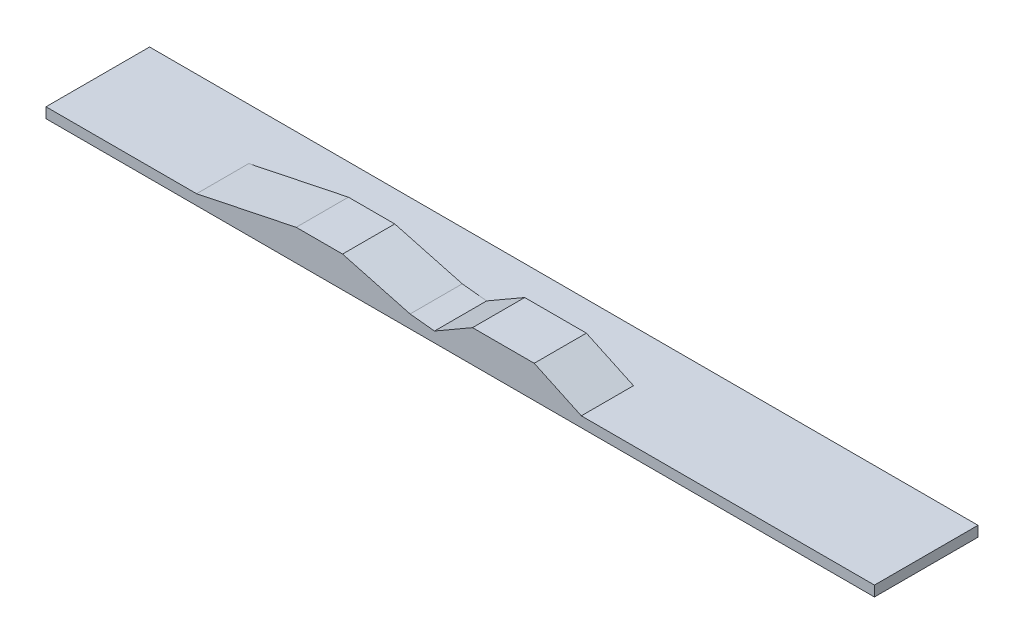
ISO-10303-21;
HEADER;
FILE_DESCRIPTION(('STEP AP214'),'2;1');
FILE_NAME('part.step','',(''),(''),'','','');
FILE_SCHEMA(('AUTOMOTIVE_DESIGN { 1 0 10303 214 1 1 1 1 }'));
ENDSEC;
DATA;
#1=APPLICATION_CONTEXT('core data for automotive mechanical design processes');
#2=APPLICATION_PROTOCOL_DEFINITION('international standard','automotive_design',2000,#1);
#3=PRODUCT_CONTEXT('',#1,'mechanical');
#4=PRODUCT('Part','Part','',(#3));
#5=PRODUCT_RELATED_PRODUCT_CATEGORY('part','',(#4));
#6=PRODUCT_DEFINITION_FORMATION('','',#4);
#7=PRODUCT_DEFINITION_CONTEXT('part definition',#1,'design');
#8=PRODUCT_DEFINITION('design','',#6,#7);
#9=PRODUCT_DEFINITION_SHAPE('','',#8);
#10=(LENGTH_UNIT() NAMED_UNIT(*) SI_UNIT(.MILLI.,.METRE.));
#11=(NAMED_UNIT(*) PLANE_ANGLE_UNIT() SI_UNIT($,.RADIAN.));
#12=(NAMED_UNIT(*) SI_UNIT($,.STERADIAN.) SOLID_ANGLE_UNIT());
#13=UNCERTAINTY_MEASURE_WITH_UNIT(LENGTH_MEASURE(1.E-05),#10,'distance_accuracy_value','');
#14=(GEOMETRIC_REPRESENTATION_CONTEXT(3) GLOBAL_UNCERTAINTY_ASSIGNED_CONTEXT((#13)) GLOBAL_UNIT_ASSIGNED_CONTEXT((#10,
#11,#12)) REPRESENTATION_CONTEXT('',''));
#15=CARTESIAN_POINT('',(0.,0.,0.));
#16=DIRECTION('',(0.,0.,1.));
#17=DIRECTION('',(1.,0.,0.));
#18=AXIS2_PLACEMENT_3D('',#15,#16,#17);
#19=CARTESIAN_POINT('',(4000.,100.,-500.));
#20=DIRECTION('',(-1.,0.,0.));
#21=DIRECTION('',(0.,0.,1.));
#22=AXIS2_PLACEMENT_3D('',#19,#20,#21);
#23=PLANE('',#22);
#24=DIRECTION('',(0.,0.,-1.));
#25=VECTOR('',#24,1.);
#26=CARTESIAN_POINT('',(4000.,0.,-500.));
#27=LINE('',#26,#25);
#28=CARTESIAN_POINT('',(4000.,0.,500.));
#29=VERTEX_POINT('',#28);
#30=CARTESIAN_POINT('',(4000.,0.,-500.));
#31=VERTEX_POINT('',#30);
#32=EDGE_CURVE('E201',#29,#31,#27,.T.);
#33=ORIENTED_EDGE('',*,*,#32,.T.);
#34=DIRECTION('',(0.,-1.,0.));
#35=VECTOR('',#34,1.);
#36=CARTESIAN_POINT('',(4000.,100.,-500.));
#37=LINE('',#36,#35);
#38=CARTESIAN_POINT('',(4000.,100.,-500.));
#39=VERTEX_POINT('',#38);
#40=EDGE_CURVE('E11',#39,#31,#37,.T.);
#41=ORIENTED_EDGE('',*,*,#40,.F.);
#42=DIRECTION('',(0.,0.,-1.));
#43=VECTOR('',#42,1.);
#44=CARTESIAN_POINT('',(4000.,100.,-500.));
#45=LINE('',#44,#43);
#46=CARTESIAN_POINT('',(4000.,100.,500.));
#47=VERTEX_POINT('',#46);
#48=EDGE_CURVE('E189',#47,#39,#45,.T.);
#49=ORIENTED_EDGE('',*,*,#48,.F.);
#50=DIRECTION('',(0.,-1.,0.));
#51=VECTOR('',#50,1.);
#52=CARTESIAN_POINT('',(4000.,100.,500.));
#53=LINE('',#52,#51);
#54=EDGE_CURVE('E200',#47,#29,#53,.T.);
#55=ORIENTED_EDGE('',*,*,#54,.T.);
#56=EDGE_LOOP('',(#33,#41,#49,#55));
#57=FACE_BOUND('',#56,.T.);
#58=ADVANCED_FACE('F33',(#57),#23,.F.);
#59=CARTESIAN_POINT('',(-4000.,100.,-500.));
#60=DIRECTION('',(0.,0.,1.));
#61=DIRECTION('',(1.,0.,0.));
#62=AXIS2_PLACEMENT_3D('',#59,#60,#61);
#63=PLANE('',#62);
#64=DIRECTION('',(-1.,0.,0.));
#65=VECTOR('',#64,1.);
#66=CARTESIAN_POINT('',(-4000.,0.,-500.));
#67=LINE('',#66,#65);
#68=CARTESIAN_POINT('',(-4000.,0.,-500.));
#69=VERTEX_POINT('',#68);
#70=EDGE_CURVE('E204',#31,#69,#67,.T.);
#71=ORIENTED_EDGE('',*,*,#70,.T.);
#72=DIRECTION('',(0.,-1.,0.));
#73=VECTOR('',#72,1.);
#74=CARTESIAN_POINT('',(-4000.,100.,-500.));
#75=LINE('',#74,#73);
#76=CARTESIAN_POINT('',(-4000.,100.,-500.));
#77=VERTEX_POINT('',#76);
#78=EDGE_CURVE('E40',#77,#69,#75,.T.);
#79=ORIENTED_EDGE('',*,*,#78,.F.);
#80=DIRECTION('',(-1.,0.,0.));
#81=VECTOR('',#80,1.);
#82=CARTESIAN_POINT('',(-4000.,100.,-500.));
#83=LINE('',#82,#81);
#84=EDGE_CURVE('E192',#39,#77,#83,.T.);
#85=ORIENTED_EDGE('',*,*,#84,.F.);
#86=ORIENTED_EDGE('',*,*,#40,.T.);
#87=EDGE_LOOP('',(#71,#79,#85,#86));
#88=FACE_BOUND('',#87,.T.);
#89=ADVANCED_FACE('F265',(#88),#63,.F.);
#90=CARTESIAN_POINT('',(-4000.,100.,-500.));
#91=DIRECTION('',(1.,0.,0.));
#92=DIRECTION('',(0.,0.,-1.));
#93=AXIS2_PLACEMENT_3D('',#90,#91,#92);
#94=PLANE('',#93);
#95=DIRECTION('',(0.,0.,1.));
#96=VECTOR('',#95,1.);
#97=CARTESIAN_POINT('',(-4000.,0.,-500.));
#98=LINE('',#97,#96);
#99=CARTESIAN_POINT('',(-4000.,0.,500.));
#100=VERTEX_POINT('',#99);
#101=EDGE_CURVE('E206',#69,#100,#98,.T.);
#102=ORIENTED_EDGE('',*,*,#101,.T.);
#103=DIRECTION('',(0.,-1.,0.));
#104=VECTOR('',#103,1.);
#105=CARTESIAN_POINT('',(-4000.,100.,500.));
#106=LINE('',#105,#104);
#107=CARTESIAN_POINT('',(-4000.,100.,500.));
#108=VERTEX_POINT('',#107);
#109=EDGE_CURVE('E211',#108,#100,#106,.T.);
#110=ORIENTED_EDGE('',*,*,#109,.F.);
#111=DIRECTION('',(0.,0.,1.));
#112=VECTOR('',#111,1.);
#113=CARTESIAN_POINT('',(-4000.,100.,-500.));
#114=LINE('',#113,#112);
#115=EDGE_CURVE('E195',#77,#108,#114,.T.);
#116=ORIENTED_EDGE('',*,*,#115,.F.);
#117=ORIENTED_EDGE('',*,*,#78,.T.);
#118=EDGE_LOOP('',(#102,#110,#116,#117));
#119=FACE_BOUND('',#118,.T.);
#120=ADVANCED_FACE('F218',(#119),#94,.F.);
#121=CARTESIAN_POINT('',(-4000.,100.,500.));
#122=DIRECTION('',(0.,0.,-1.));
#123=DIRECTION('',(-1.,0.,0.));
#124=AXIS2_PLACEMENT_3D('',#121,#122,#123);
#125=PLANE('',#124);
#126=DIRECTION('',(1.,0.,0.));
#127=VECTOR('',#126,1.);
#128=CARTESIAN_POINT('',(-4000.,0.,500.));
#129=LINE('',#128,#127);
#130=EDGE_CURVE('E193',#100,#29,#129,.T.);
#131=ORIENTED_EDGE('',*,*,#130,.T.);
#132=ORIENTED_EDGE('',*,*,#54,.F.);
#133=DIRECTION('',(1.,0.,0.));
#134=VECTOR('',#133,1.);
#135=CARTESIAN_POINT('',(-4000.,100.,500.));
#136=LINE('',#135,#134);
#137=CARTESIAN_POINT('',(1169.32491758126,100.,500.));
#138=VERTEX_POINT('',#137);
#139=EDGE_CURVE('E197',#138,#47,#136,.T.);
#140=ORIENTED_EDGE('',*,*,#139,.F.);
#141=DIRECTION('',(-0.906307787036653,0.422618261740693,0.));
#142=VECTOR('',#141,1.);
#143=CARTESIAN_POINT('',(1169.32491758126,100.,500.));
#144=LINE('',#143,#142);
#145=CARTESIAN_POINT('',(714.418726972416,312.126240423016,500.));
#146=VERTEX_POINT('',#145);
#147=EDGE_CURVE('E162',#138,#146,#144,.T.);
#148=ORIENTED_EDGE('',*,*,#147,.T.);
#149=DIRECTION('',(-1.,0.,0.));
#150=VECTOR('',#149,1.);
#151=CARTESIAN_POINT('',(714.418726972416,312.126240423016,500.));
#152=LINE('',#151,#150);
#153=CARTESIAN_POINT('',(118.620890375649,312.126240423016,500.));
#154=VERTEX_POINT('',#153);
#155=EDGE_CURVE('E124',#146,#154,#152,.T.);
#156=ORIENTED_EDGE('',*,*,#155,.T.);
#157=DIRECTION('',(-0.866025403784438,-0.500000000000001,0.));
#158=VECTOR('',#157,1.);
#159=CARTESIAN_POINT('',(118.620890375649,312.126240423016,500.));
#160=LINE('',#159,#158);
#161=CARTESIAN_POINT('',(-248.792535655586,100.,500.));
#162=VERTEX_POINT('',#161);
#163=EDGE_CURVE('E165',#154,#162,#160,.T.);
#164=ORIENTED_EDGE('',*,*,#163,.T.);
#165=DIRECTION('',(-0.994292886629567,0.106684842399676,0.));
#166=VECTOR('',#165,1.);
#167=CARTESIAN_POINT('',(-248.792535655586,100.,500.));
#168=LINE('',#167,#166);
#169=CARTESIAN_POINT('',(-483.88085604275,125.224318455627,500.));
#170=VERTEX_POINT('',#169);
#171=EDGE_CURVE('E168',#162,#170,#168,.T.);
#172=ORIENTED_EDGE('',*,*,#171,.T.);
#173=DIRECTION('',(-0.96592582628907,0.258819045102514,0.));
#174=VECTOR('',#173,1.);
#175=CARTESIAN_POINT('',(-1136.15257949384,300.,500.));
#176=LINE('',#175,#174);
#177=CARTESIAN_POINT('',(-1136.15257949384,300.,500.));
#178=VERTEX_POINT('',#177);
#179=EDGE_CURVE('E171',#170,#178,#176,.T.);
#180=ORIENTED_EDGE('',*,*,#179,.T.);
#181=DIRECTION('',(-1.,0.,0.));
#182=VECTOR('',#181,1.);
#183=CARTESIAN_POINT('',(-1136.15257949384,300.,500.));
#184=LINE('',#183,#182);
#185=CARTESIAN_POINT('',(-1583.9791436739,300.,500.));
#186=VERTEX_POINT('',#185);
#187=EDGE_CURVE('E146',#178,#186,#184,.T.);
#188=ORIENTED_EDGE('',*,*,#187,.T.);
#189=DIRECTION('',(-0.979064913274181,-0.20354826355295,0.));
#190=VECTOR('',#189,1.);
#191=CARTESIAN_POINT('',(-1583.9791436739,300.,500.));
#192=LINE('',#191,#190);
#193=CARTESIAN_POINT('',(-2545.97694820883,100.,500.));
#194=VERTEX_POINT('',#193);
#195=EDGE_CURVE('E143',#186,#194,#192,.T.);
#196=ORIENTED_EDGE('',*,*,#195,.T.);
#197=EDGE_CURVE('E198',#108,#194,#136,.T.);
#198=ORIENTED_EDGE('',*,*,#197,.F.);
#199=ORIENTED_EDGE('',*,*,#109,.T.);
#200=EDGE_LOOP('',(#131,#132,#140,#148,#156,#164,#172,#180,#188,#196,#198,#199));
#201=FACE_BOUND('',#200,.T.);
#202=ADVANCED_FACE('F227',(#201),#125,.F.);
#203=CARTESIAN_POINT('',(0.,100.,0.));
#204=DIRECTION('',(0.,1.,0.));
#205=DIRECTION('',(0.,0.,1.));
#206=AXIS2_PLACEMENT_3D('',#203,#204,#205);
#207=PLANE('',#206);
#208=ORIENTED_EDGE('',*,*,#139,.T.);
#209=ORIENTED_EDGE('',*,*,#48,.T.);
#210=ORIENTED_EDGE('',*,*,#84,.T.);
#211=ORIENTED_EDGE('',*,*,#115,.T.);
#212=ORIENTED_EDGE('',*,*,#197,.T.);
#213=DIRECTION('',(0.,0.,1.));
#214=VECTOR('',#213,1.);
#215=CARTESIAN_POINT('',(-2545.97694820883,100.,-3.99999999999978));
#216=LINE('',#215,#214);
#217=CARTESIAN_POINT('',(-2545.97694820883,100.,-3.99999999999978));
#218=VERTEX_POINT('',#217);
#219=EDGE_CURVE('E47',#218,#194,#216,.T.);
#220=ORIENTED_EDGE('',*,*,#219,.F.);
#221=DIRECTION('',(1.,0.,0.));
#222=VECTOR('',#221,1.);
#223=CARTESIAN_POINT('',(0.,100.,-3.99999999999978));
#224=LINE('',#223,#222);
#225=CARTESIAN_POINT('',(-248.792535655586,100.,-3.99999999999978));
#226=VERTEX_POINT('',#225);
#227=EDGE_CURVE('E51',#218,#226,#224,.T.);
#228=ORIENTED_EDGE('',*,*,#227,.T.);
#229=CARTESIAN_POINT('',(1169.32491758126,100.,-3.99999999999978));
#230=VERTEX_POINT('',#229);
#231=EDGE_CURVE('E177',#226,#230,#224,.T.);
#232=ORIENTED_EDGE('',*,*,#231,.T.);
#233=DIRECTION('',(0.,0.,1.));
#234=VECTOR('',#233,1.);
#235=CARTESIAN_POINT('',(1169.32491758126,100.,-3.99999999999978));
#236=LINE('',#235,#234);
#237=EDGE_CURVE('E130',#230,#138,#236,.T.);
#238=ORIENTED_EDGE('',*,*,#237,.T.);
#239=EDGE_LOOP('',(#208,#209,#210,#211,#212,#220,#228,#232,#238));
#240=FACE_BOUND('',#239,.T.);
#241=ADVANCED_FACE('F232',(#240),#207,.T.);
#242=CARTESIAN_POINT('',(0.,0.,0.));
#243=DIRECTION('',(0.,1.,0.));
#244=DIRECTION('',(0.,0.,1.));
#245=AXIS2_PLACEMENT_3D('',#242,#243,#244);
#246=PLANE('',#245);
#247=ORIENTED_EDGE('',*,*,#32,.F.);
#248=ORIENTED_EDGE('',*,*,#130,.F.);
#249=ORIENTED_EDGE('',*,*,#101,.F.);
#250=ORIENTED_EDGE('',*,*,#70,.F.);
#251=EDGE_LOOP('',(#247,#248,#249,#250));
#252=FACE_BOUND('',#251,.T.);
#253=ADVANCED_FACE('F224',(#252),#246,.F.);
#254=CARTESIAN_POINT('',(0.,0.,-3.99999999999978));
#255=DIRECTION('',(0.,0.,1.));
#256=DIRECTION('',(1.,0.,0.));
#257=AXIS2_PLACEMENT_3D('',#254,#255,#256);
#258=PLANE('',#257);
#259=ORIENTED_EDGE('',*,*,#227,.F.);
#260=DIRECTION('',(-0.979064913274181,-0.20354826355295,0.));
#261=VECTOR('',#260,1.);
#262=CARTESIAN_POINT('',(-1583.9791436739,300.,-3.99999999999978));
#263=LINE('',#262,#261);
#264=CARTESIAN_POINT('',(-1583.9791436739,300.,-3.99999999999978));
#265=VERTEX_POINT('',#264);
#266=EDGE_CURVE('E159',#265,#218,#263,.T.);
#267=ORIENTED_EDGE('',*,*,#266,.F.);
#268=DIRECTION('',(-1.,0.,0.));
#269=VECTOR('',#268,1.);
#270=CARTESIAN_POINT('',(-1136.15257949384,300.,-3.99999999999978));
#271=LINE('',#270,#269);
#272=CARTESIAN_POINT('',(-1136.15257949384,300.,-3.99999999999978));
#273=VERTEX_POINT('',#272);
#274=EDGE_CURVE('E156',#273,#265,#271,.T.);
#275=ORIENTED_EDGE('',*,*,#274,.F.);
#276=DIRECTION('',(-0.96592582628907,0.258819045102514,0.));
#277=VECTOR('',#276,1.);
#278=CARTESIAN_POINT('',(-1136.15257949384,300.,-3.99999999999978));
#279=LINE('',#278,#277);
#280=CARTESIAN_POINT('',(-483.88085604275,125.224318455627,-3.99999999999978));
#281=VERTEX_POINT('',#280);
#282=EDGE_CURVE('E153',#281,#273,#279,.T.);
#283=ORIENTED_EDGE('',*,*,#282,.F.);
#284=DIRECTION('',(-0.994292886629567,0.106684842399676,0.));
#285=VECTOR('',#284,1.);
#286=CARTESIAN_POINT('',(-248.792535655586,100.,-3.99999999999978));
#287=LINE('',#286,#285);
#288=EDGE_CURVE('E150',#226,#281,#287,.T.);
#289=ORIENTED_EDGE('',*,*,#288,.F.);
#290=EDGE_LOOP('',(#259,#267,#275,#283,#289));
#291=FACE_BOUND('',#290,.T.);
#292=ADVANCED_FACE('F254',(#291),#258,.F.);
#293=CARTESIAN_POINT('',(-1583.9791436739,300.,-3.99999999999978));
#294=DIRECTION('',(-0.20354826355295,0.979064913274181,0.));
#295=DIRECTION('',(-0.979064913274181,-0.20354826355295,0.));
#296=AXIS2_PLACEMENT_3D('',#293,#294,#295);
#297=PLANE('',#296);
#298=ORIENTED_EDGE('',*,*,#195,.F.);
#299=DIRECTION('',(0.,0.,1.));
#300=VECTOR('',#299,1.);
#301=CARTESIAN_POINT('',(-1583.9791436739,300.,-3.99999999999978));
#302=LINE('',#301,#300);
#303=EDGE_CURVE('E178',#265,#186,#302,.T.);
#304=ORIENTED_EDGE('',*,*,#303,.F.);
#305=ORIENTED_EDGE('',*,*,#266,.T.);
#306=ORIENTED_EDGE('',*,*,#219,.T.);
#307=EDGE_LOOP('',(#298,#304,#305,#306));
#308=FACE_BOUND('',#307,.T.);
#309=ADVANCED_FACE('F252',(#308),#297,.T.);
#310=CARTESIAN_POINT('',(-1136.15257949384,300.,-3.99999999999978));
#311=DIRECTION('',(0.,1.,0.));
#312=DIRECTION('',(-1.,0.,0.));
#313=AXIS2_PLACEMENT_3D('',#310,#311,#312);
#314=PLANE('',#313);
#315=ORIENTED_EDGE('',*,*,#187,.F.);
#316=DIRECTION('',(0.,0.,1.));
#317=VECTOR('',#316,1.);
#318=CARTESIAN_POINT('',(-1136.15257949384,300.,-3.99999999999978));
#319=LINE('',#318,#317);
#320=EDGE_CURVE('E180',#273,#178,#319,.T.);
#321=ORIENTED_EDGE('',*,*,#320,.F.);
#322=ORIENTED_EDGE('',*,*,#274,.T.);
#323=ORIENTED_EDGE('',*,*,#303,.T.);
#324=EDGE_LOOP('',(#315,#321,#322,#323));
#325=FACE_BOUND('',#324,.T.);
#326=ADVANCED_FACE('F248',(#325),#314,.T.);
#327=CARTESIAN_POINT('',(-1136.15257949384,300.,-3.99999999999978));
#328=DIRECTION('',(0.258819045102514,0.96592582628907,0.));
#329=DIRECTION('',(-0.96592582628907,0.258819045102514,0.));
#330=AXIS2_PLACEMENT_3D('',#327,#328,#329);
#331=PLANE('',#330);
#332=ORIENTED_EDGE('',*,*,#179,.F.);
#333=DIRECTION('',(0.,0.,1.));
#334=VECTOR('',#333,1.);
#335=CARTESIAN_POINT('',(-483.88085604275,125.224318455627,-3.99999999999978));
#336=LINE('',#335,#334);
#337=EDGE_CURVE('E182',#281,#170,#336,.T.);
#338=ORIENTED_EDGE('',*,*,#337,.F.);
#339=ORIENTED_EDGE('',*,*,#282,.T.);
#340=ORIENTED_EDGE('',*,*,#320,.T.);
#341=EDGE_LOOP('',(#332,#338,#339,#340));
#342=FACE_BOUND('',#341,.T.);
#343=ADVANCED_FACE('F244',(#342),#331,.T.);
#344=CARTESIAN_POINT('',(-248.792535655586,100.,-3.99999999999978));
#345=DIRECTION('',(0.106684842399676,0.994292886629566,0.));
#346=DIRECTION('',(-0.994292886629567,0.106684842399676,0.));
#347=AXIS2_PLACEMENT_3D('',#344,#345,#346);
#348=PLANE('',#347);
#349=ORIENTED_EDGE('',*,*,#171,.F.);
#350=DIRECTION('',(0.,0.,1.));
#351=VECTOR('',#350,1.);
#352=CARTESIAN_POINT('',(-248.792535655586,100.,-3.99999999999978));
#353=LINE('',#352,#351);
#354=EDGE_CURVE('E184',#226,#162,#353,.T.);
#355=ORIENTED_EDGE('',*,*,#354,.F.);
#356=ORIENTED_EDGE('',*,*,#288,.T.);
#357=ORIENTED_EDGE('',*,*,#337,.T.);
#358=EDGE_LOOP('',(#349,#355,#356,#357));
#359=FACE_BOUND('',#358,.T.);
#360=ADVANCED_FACE('F240',(#359),#348,.T.);
#361=CARTESIAN_POINT('',(118.620890375649,312.126240423016,-3.99999999999978));
#362=DIRECTION('',(-0.500000000000001,0.866025403784438,0.));
#363=DIRECTION('',(-0.866025403784438,-0.500000000000001,0.));
#364=AXIS2_PLACEMENT_3D('',#361,#362,#363);
#365=PLANE('',#364);
#366=ORIENTED_EDGE('',*,*,#163,.F.);
#367=DIRECTION('',(0.,0.,1.));
#368=VECTOR('',#367,1.);
#369=CARTESIAN_POINT('',(118.620890375649,312.126240423016,-3.99999999999978));
#370=LINE('',#369,#368);
#371=CARTESIAN_POINT('',(118.620890375649,312.126240423016,-3.99999999999978));
#372=VERTEX_POINT('',#371);
#373=EDGE_CURVE('E129',#372,#154,#370,.T.);
#374=ORIENTED_EDGE('',*,*,#373,.F.);
#375=DIRECTION('',(-0.866025403784438,-0.500000000000001,0.));
#376=VECTOR('',#375,1.);
#377=CARTESIAN_POINT('',(118.620890375649,312.126240423016,-3.99999999999978));
#378=LINE('',#377,#376);
#379=EDGE_CURVE('E138',#372,#226,#378,.T.);
#380=ORIENTED_EDGE('',*,*,#379,.T.);
#381=ORIENTED_EDGE('',*,*,#354,.T.);
#382=EDGE_LOOP('',(#366,#374,#380,#381));
#383=FACE_BOUND('',#382,.T.);
#384=ADVANCED_FACE('F236',(#383),#365,.T.);
#385=CARTESIAN_POINT('',(714.418726972416,312.126240423016,-3.99999999999978));
#386=DIRECTION('',(0.,1.,0.));
#387=DIRECTION('',(-1.,0.,0.));
#388=AXIS2_PLACEMENT_3D('',#385,#386,#387);
#389=PLANE('',#388);
#390=ORIENTED_EDGE('',*,*,#155,.F.);
#391=DIRECTION('',(0.,0.,1.));
#392=VECTOR('',#391,1.);
#393=CARTESIAN_POINT('',(714.418726972416,312.126240423016,-3.99999999999978));
#394=LINE('',#393,#392);
#395=CARTESIAN_POINT('',(714.418726972416,312.126240423016,-3.99999999999978));
#396=VERTEX_POINT('',#395);
#397=EDGE_CURVE('E119',#396,#146,#394,.T.);
#398=ORIENTED_EDGE('',*,*,#397,.F.);
#399=DIRECTION('',(-1.,0.,0.));
#400=VECTOR('',#399,1.);
#401=CARTESIAN_POINT('',(714.418726972416,312.126240423016,-3.99999999999978));
#402=LINE('',#401,#400);
#403=EDGE_CURVE('E122',#396,#372,#402,.T.);
#404=ORIENTED_EDGE('',*,*,#403,.T.);
#405=ORIENTED_EDGE('',*,*,#373,.T.);
#406=EDGE_LOOP('',(#390,#398,#404,#405));
#407=FACE_BOUND('',#406,.T.);
#408=ADVANCED_FACE('F121',(#407),#389,.T.);
#409=CARTESIAN_POINT('',(1169.32491758126,100.,-3.99999999999978));
#410=DIRECTION('',(0.422618261740693,0.906307787036653,0.));
#411=DIRECTION('',(-0.906307787036653,0.422618261740694,0.));
#412=AXIS2_PLACEMENT_3D('',#409,#410,#411);
#413=PLANE('',#412);
#414=ORIENTED_EDGE('',*,*,#147,.F.);
#415=ORIENTED_EDGE('',*,*,#237,.F.);
#416=DIRECTION('',(-0.906307787036653,0.422618261740693,0.));
#417=VECTOR('',#416,1.);
#418=CARTESIAN_POINT('',(1169.32491758126,100.,-3.99999999999978));
#419=LINE('',#418,#417);
#420=EDGE_CURVE('E136',#230,#396,#419,.T.);
#421=ORIENTED_EDGE('',*,*,#420,.T.);
#422=ORIENTED_EDGE('',*,*,#397,.T.);
#423=EDGE_LOOP('',(#414,#415,#421,#422));
#424=FACE_BOUND('',#423,.T.);
#425=ADVANCED_FACE('F141',(#424),#413,.T.);
#426=ORIENTED_EDGE('',*,*,#231,.F.);
#427=ORIENTED_EDGE('',*,*,#379,.F.);
#428=ORIENTED_EDGE('',*,*,#403,.F.);
#429=ORIENTED_EDGE('',*,*,#420,.F.);
#430=EDGE_LOOP('',(#426,#427,#428,#429));
#431=FACE_BOUND('',#430,.T.);
#432=ADVANCED_FACE('F135',(#431),#258,.F.);
#433=CLOSED_SHELL('',(#58,#89,#120,#202,#241,#253,#292,#309,#326,#343,#360,#384,#408,#425,#432));
#434=MANIFOLD_SOLID_BREP('B2',#433);
#435=ADVANCED_BREP_SHAPE_REPRESENTATION('',(#18,#434),#14);
#436=SHAPE_DEFINITION_REPRESENTATION(#9,#435);
ENDSEC;
END-ISO-10303-21;
